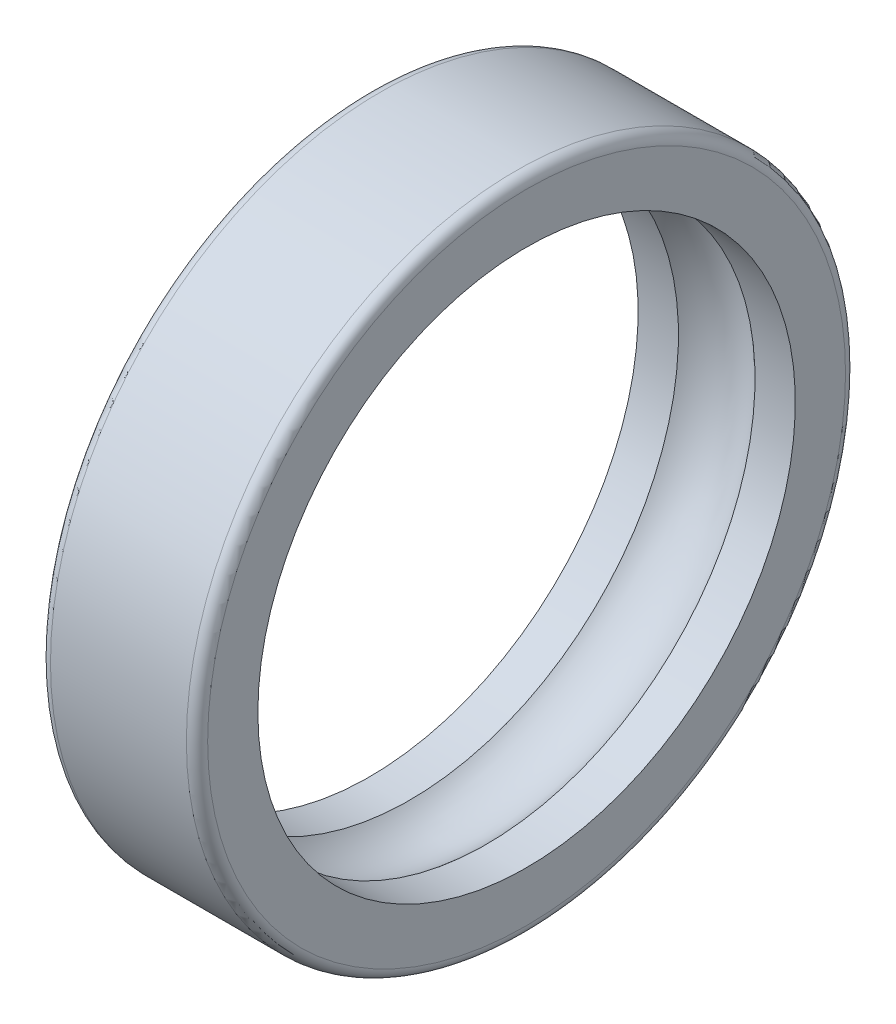
ISO-10303-21;
HEADER;
FILE_DESCRIPTION(('STEP AP214'),'2;1');
FILE_NAME('part.step','',(''),(''),'','','');
FILE_SCHEMA(('AUTOMOTIVE_DESIGN { 1 0 10303 214 1 1 1 1 }'));
ENDSEC;
DATA;
#1=APPLICATION_CONTEXT('core data for automotive mechanical design processes');
#2=APPLICATION_PROTOCOL_DEFINITION('international standard','automotive_design',2000,#1);
#3=PRODUCT_CONTEXT('',#1,'mechanical');
#4=PRODUCT('Part','Part','',(#3));
#5=PRODUCT_RELATED_PRODUCT_CATEGORY('part','',(#4));
#6=PRODUCT_DEFINITION_FORMATION('','',#4);
#7=PRODUCT_DEFINITION_CONTEXT('part definition',#1,'design');
#8=PRODUCT_DEFINITION('design','',#6,#7);
#9=PRODUCT_DEFINITION_SHAPE('','',#8);
#10=(LENGTH_UNIT() NAMED_UNIT(*) SI_UNIT(.MILLI.,.METRE.));
#11=(NAMED_UNIT(*) PLANE_ANGLE_UNIT() SI_UNIT($,.RADIAN.));
#12=(NAMED_UNIT(*) SI_UNIT($,.STERADIAN.) SOLID_ANGLE_UNIT());
#13=UNCERTAINTY_MEASURE_WITH_UNIT(LENGTH_MEASURE(1.E-05),#10,'distance_accuracy_value','');
#14=(GEOMETRIC_REPRESENTATION_CONTEXT(3) GLOBAL_UNCERTAINTY_ASSIGNED_CONTEXT((#13)) GLOBAL_UNIT_ASSIGNED_CONTEXT((#10,
#11,#12)) REPRESENTATION_CONTEXT('',''));
#15=CARTESIAN_POINT('',(0.,0.,0.));
#16=DIRECTION('',(0.,0.,1.));
#17=DIRECTION('',(1.,0.,0.));
#18=AXIS2_PLACEMENT_3D('',#15,#16,#17);
#19=CARTESIAN_POINT('',(121.178581059563,0.,-53.));
#20=DIRECTION('',(1.,0.,0.));
#21=DIRECTION('',(0.,0.,-1.));
#22=AXIS2_PLACEMENT_3D('',#19,#20,#21);
#23=PLANE('',#22);
#24=CARTESIAN_POINT('',(121.178581059563,0.,0.));
#25=DIRECTION('',(1.,0.,0.));
#26=DIRECTION('',(0.,0.,-1.));
#27=AXIS2_PLACEMENT_3D('',#24,#25,#26);
#28=CIRCLE('',#27,62.9);
#29=CARTESIAN_POINT('',(121.178581059563,0.,-62.9));
#30=VERTEX_POINT('',#29);
#31=EDGE_CURVE('E10',#30,#30,#28,.F.);
#32=ORIENTED_EDGE('',*,*,#31,.T.);
#33=EDGE_LOOP('',(#32));
#34=FACE_BOUND('',#33,.T.);
#35=CARTESIAN_POINT('',(121.178581059563,0.,0.));
#36=DIRECTION('',(-1.,0.,0.));
#37=DIRECTION('',(0.,0.,1.));
#38=AXIS2_PLACEMENT_3D('',#35,#36,#37);
#39=CIRCLE('',#38,53.);
#40=CARTESIAN_POINT('',(121.178581059563,0.,53.));
#41=VERTEX_POINT('',#40);
#42=EDGE_CURVE('E79',#41,#41,#39,.T.);
#43=ORIENTED_EDGE('',*,*,#42,.F.);
#44=EDGE_LOOP('',(#43));
#45=FACE_BOUND('',#44,.T.);
#46=ADVANCED_FACE('F43',(#34,#45),#23,.F.);
#47=CARTESIAN_POINT('',(-165.42600896861,0.,0.));
#48=DIRECTION('',(-1.,0.,0.));
#49=DIRECTION('',(0.,0.,1.));
#50=AXIS2_PLACEMENT_3D('',#47,#48,#49);
#51=CYLINDRICAL_SURFACE('',#50,65.);
#52=CARTESIAN_POINT('',(150.078581059563,0.,0.));
#53=DIRECTION('',(-1.,0.,0.));
#54=DIRECTION('',(0.,0.,1.));
#55=AXIS2_PLACEMENT_3D('',#52,#53,#54);
#56=CIRCLE('',#55,65.);
#57=CARTESIAN_POINT('',(150.078581059563,0.,65.));
#58=VERTEX_POINT('',#57);
#59=EDGE_CURVE('E56',#58,#58,#56,.T.);
#60=ORIENTED_EDGE('',*,*,#59,.T.);
#61=EDGE_LOOP('',(#60));
#62=FACE_BOUND('',#61,.T.);
#63=CARTESIAN_POINT('',(123.278581059563,0.,0.));
#64=DIRECTION('',(1.,0.,0.));
#65=DIRECTION('',(0.,0.,-1.));
#66=AXIS2_PLACEMENT_3D('',#63,#64,#65);
#67=CIRCLE('',#66,65.);
#68=CARTESIAN_POINT('',(123.278581059563,0.,-65.));
#69=VERTEX_POINT('',#68);
#70=EDGE_CURVE('E61',#69,#69,#67,.T.);
#71=ORIENTED_EDGE('',*,*,#70,.T.);
#72=EDGE_LOOP('',(#71));
#73=FACE_BOUND('',#72,.T.);
#74=ADVANCED_FACE('F87',(#62,#73),#51,.T.);
#75=CARTESIAN_POINT('',(152.178581059563,0.,-53.));
#76=DIRECTION('',(-1.,0.,0.));
#77=DIRECTION('',(0.,0.,1.));
#78=AXIS2_PLACEMENT_3D('',#75,#76,#77);
#79=PLANE('',#78);
#80=CARTESIAN_POINT('',(152.178581059563,0.,0.));
#81=DIRECTION('',(-1.,0.,0.));
#82=DIRECTION('',(0.,0.,1.));
#83=AXIS2_PLACEMENT_3D('',#80,#81,#82);
#84=CIRCLE('',#83,62.9);
#85=CARTESIAN_POINT('',(152.178581059563,0.,62.9));
#86=VERTEX_POINT('',#85);
#87=EDGE_CURVE('E51',#86,#86,#84,.F.);
#88=ORIENTED_EDGE('',*,*,#87,.T.);
#89=EDGE_LOOP('',(#88));
#90=FACE_BOUND('',#89,.T.);
#91=CARTESIAN_POINT('',(152.178581059563,0.,0.));
#92=DIRECTION('',(-1.,0.,0.));
#93=DIRECTION('',(0.,0.,1.));
#94=AXIS2_PLACEMENT_3D('',#91,#92,#93);
#95=CIRCLE('',#94,53.);
#96=CARTESIAN_POINT('',(152.178581059563,0.,53.));
#97=VERTEX_POINT('',#96);
#98=EDGE_CURVE('E67',#97,#97,#95,.T.);
#99=ORIENTED_EDGE('',*,*,#98,.T.);
#100=EDGE_LOOP('',(#99));
#101=FACE_BOUND('',#100,.T.);
#102=ADVANCED_FACE('F93',(#90,#101),#79,.F.);
#103=CARTESIAN_POINT('',(-165.42600896861,0.,0.));
#104=DIRECTION('',(-1.,0.,0.));
#105=DIRECTION('',(0.,0.,1.));
#106=AXIS2_PLACEMENT_3D('',#103,#104,#105);
#107=CYLINDRICAL_SURFACE('',#106,53.);
#108=ORIENTED_EDGE('',*,*,#98,.F.);
#109=EDGE_LOOP('',(#108));
#110=FACE_BOUND('',#109,.T.);
#111=CARTESIAN_POINT('',(144.228415494834,0.,0.));
#112=DIRECTION('',(-1.,0.,0.));
#113=DIRECTION('',(0.,0.,1.));
#114=AXIS2_PLACEMENT_3D('',#111,#112,#113);
#115=CIRCLE('',#114,53.);
#116=CARTESIAN_POINT('',(144.228415494834,0.,53.));
#117=VERTEX_POINT('',#116);
#118=EDGE_CURVE('E71',#117,#117,#115,.T.);
#119=ORIENTED_EDGE('',*,*,#118,.T.);
#120=EDGE_LOOP('',(#119));
#121=FACE_BOUND('',#120,.T.);
#122=ADVANCED_FACE('F116',(#110,#121),#107,.F.);
#123=CARTESIAN_POINT('',(136.678581059563,0.,0.));
#124=DIRECTION('',(-1.,0.,0.));
#125=DIRECTION('',(0.,0.,1.));
#126=AXIS2_PLACEMENT_3D('',#123,#124,#125);
#127=TOROIDAL_SURFACE('',#126,45.,11.);
#128=ORIENTED_EDGE('',*,*,#118,.F.);
#129=EDGE_LOOP('',(#128));
#130=FACE_BOUND('',#129,.T.);
#131=CARTESIAN_POINT('',(129.128746624293,0.,0.));
#132=DIRECTION('',(-1.,0.,0.));
#133=DIRECTION('',(0.,0.,1.));
#134=AXIS2_PLACEMENT_3D('',#131,#132,#133);
#135=CIRCLE('',#134,53.);
#136=CARTESIAN_POINT('',(129.128746624293,0.,53.));
#137=VERTEX_POINT('',#136);
#138=EDGE_CURVE('E75',#137,#137,#135,.T.);
#139=ORIENTED_EDGE('',*,*,#138,.T.);
#140=EDGE_LOOP('',(#139));
#141=FACE_BOUND('',#140,.T.);
#142=ADVANCED_FACE('F105',(#130,#141),#127,.F.);
#143=CARTESIAN_POINT('',(-165.42600896861,0.,0.));
#144=DIRECTION('',(-1.,0.,0.));
#145=DIRECTION('',(0.,0.,1.));
#146=AXIS2_PLACEMENT_3D('',#143,#144,#145);
#147=CYLINDRICAL_SURFACE('',#146,53.);
#148=ORIENTED_EDGE('',*,*,#138,.F.);
#149=EDGE_LOOP('',(#148));
#150=FACE_BOUND('',#149,.T.);
#151=ORIENTED_EDGE('',*,*,#42,.T.);
#152=EDGE_LOOP('',(#151));
#153=FACE_BOUND('',#152,.T.);
#154=ADVANCED_FACE('F84',(#150,#153),#147,.F.);
#155=CARTESIAN_POINT('',(150.078581059563,0.,0.));
#156=DIRECTION('',(-1.,0.,0.));
#157=DIRECTION('',(0.,0.,1.));
#158=AXIS2_PLACEMENT_3D('',#155,#156,#157);
#159=TOROIDAL_SURFACE('',#158,62.9,2.1);
#160=ORIENTED_EDGE('',*,*,#87,.F.);
#161=EDGE_LOOP('',(#160));
#162=FACE_BOUND('',#161,.T.);
#163=ORIENTED_EDGE('',*,*,#59,.F.);
#164=EDGE_LOOP('',(#163));
#165=FACE_BOUND('',#164,.T.);
#166=ADVANCED_FACE('F97',(#162,#165),#159,.T.);
#167=CARTESIAN_POINT('',(123.278581059563,0.,0.));
#168=DIRECTION('',(1.,0.,0.));
#169=DIRECTION('',(0.,0.,-1.));
#170=AXIS2_PLACEMENT_3D('',#167,#168,#169);
#171=TOROIDAL_SURFACE('',#170,62.9,2.1);
#172=ORIENTED_EDGE('',*,*,#70,.F.);
#173=EDGE_LOOP('',(#172));
#174=FACE_BOUND('',#173,.T.);
#175=ORIENTED_EDGE('',*,*,#31,.F.);
#176=EDGE_LOOP('',(#175));
#177=FACE_BOUND('',#176,.T.);
#178=ADVANCED_FACE('F45',(#174,#177),#171,.T.);
#179=CLOSED_SHELL('',(#46,#74,#102,#122,#142,#154,#166,#178));
#180=MANIFOLD_SOLID_BREP('B2',#179);
#181=ADVANCED_BREP_SHAPE_REPRESENTATION('',(#18,#180),#14);
#182=SHAPE_DEFINITION_REPRESENTATION(#9,#181);
ENDSEC;
END-ISO-10303-21;
